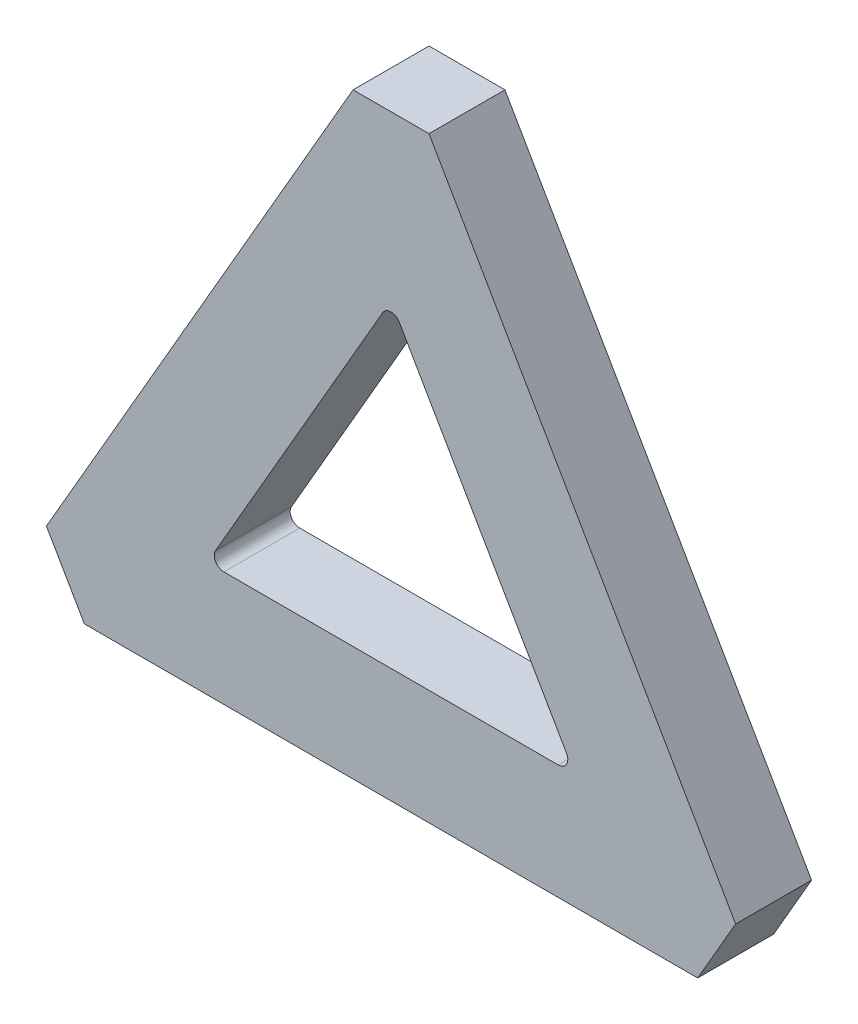
ISO-10303-21;
HEADER;
FILE_DESCRIPTION(('STEP AP214'),'2;1');
FILE_NAME('part.step','',(''),(''),'','','');
FILE_SCHEMA(('AUTOMOTIVE_DESIGN { 1 0 10303 214 1 1 1 1 }'));
ENDSEC;
DATA;
#1=APPLICATION_CONTEXT('core data for automotive mechanical design processes');
#2=APPLICATION_PROTOCOL_DEFINITION('international standard','automotive_design',2000,#1);
#3=PRODUCT_CONTEXT('',#1,'mechanical');
#4=PRODUCT('Part','Part','',(#3));
#5=PRODUCT_RELATED_PRODUCT_CATEGORY('part','',(#4));
#6=PRODUCT_DEFINITION_FORMATION('','',#4);
#7=PRODUCT_DEFINITION_CONTEXT('part definition',#1,'design');
#8=PRODUCT_DEFINITION('design','',#6,#7);
#9=PRODUCT_DEFINITION_SHAPE('','',#8);
#10=(LENGTH_UNIT() NAMED_UNIT(*) SI_UNIT(.MILLI.,.METRE.));
#11=(NAMED_UNIT(*) PLANE_ANGLE_UNIT() SI_UNIT($,.RADIAN.));
#12=(NAMED_UNIT(*) SI_UNIT($,.STERADIAN.) SOLID_ANGLE_UNIT());
#13=UNCERTAINTY_MEASURE_WITH_UNIT(LENGTH_MEASURE(1.E-05),#10,'distance_accuracy_value','');
#14=(GEOMETRIC_REPRESENTATION_CONTEXT(3) GLOBAL_UNCERTAINTY_ASSIGNED_CONTEXT((#13)) GLOBAL_UNIT_ASSIGNED_CONTEXT((#10,
#11,#12)) REPRESENTATION_CONTEXT('',''));
#15=CARTESIAN_POINT('',(0.,0.,0.));
#16=DIRECTION('',(0.,0.,1.));
#17=DIRECTION('',(1.,0.,0.));
#18=AXIS2_PLACEMENT_3D('',#15,#16,#17);
#19=CARTESIAN_POINT('',(0.,0.,1.984375));
#20=DIRECTION('',(0.,0.,-1.));
#21=DIRECTION('',(-1.,0.,0.));
#22=AXIS2_PLACEMENT_3D('',#19,#20,#21);
#23=PLANE('',#22);
#24=DIRECTION('',(-0.5,0.866025403784439,0.));
#25=VECTOR('',#24,1.);
#26=CARTESIAN_POINT('',(-10.,17.3205080756888,1.984375));
#27=LINE('',#26,#25);
#28=CARTESIAN_POINT('',(-0.992187500000001,1.71851916063475,1.984375));
#29=VERTEX_POINT('',#28);
#30=CARTESIAN_POINT('',(-9.0078125,15.601988915054,1.984375));
#31=VERTEX_POINT('',#30);
#32=EDGE_CURVE('E146',#29,#31,#27,.T.);
#33=ORIENTED_EDGE('',*,*,#32,.T.);
#34=DIRECTION('',(1.,0.,0.));
#35=VECTOR('',#34,1.);
#36=CARTESIAN_POINT('',(-10.9921875,15.601988915054,1.984375));
#37=LINE('',#36,#35);
#38=CARTESIAN_POINT('',(-10.9921875,15.601988915054,1.984375));
#39=VERTEX_POINT('',#38);
#40=EDGE_CURVE('E174',#31,#39,#37,.F.);
#41=ORIENTED_EDGE('',*,*,#40,.T.);
#42=DIRECTION('',(-0.5,-0.866025403784439,0.));
#43=VECTOR('',#42,1.);
#44=CARTESIAN_POINT('',(-20.,0.,1.984375));
#45=LINE('',#44,#43);
#46=CARTESIAN_POINT('',(-19.0078125,1.71851916063474,1.984375));
#47=VERTEX_POINT('',#46);
#48=EDGE_CURVE('E150',#39,#47,#45,.T.);
#49=ORIENTED_EDGE('',*,*,#48,.T.);
#50=DIRECTION('',(-0.500000000000001,0.866025403784438,0.));
#51=VECTOR('',#50,1.);
#52=CARTESIAN_POINT('',(-18.015625,0.,1.984375));
#53=LINE('',#52,#51);
#54=CARTESIAN_POINT('',(-18.015625,0.,1.984375));
#55=VERTEX_POINT('',#54);
#56=EDGE_CURVE('E157',#47,#55,#53,.F.);
#57=ORIENTED_EDGE('',*,*,#56,.T.);
#58=DIRECTION('',(1.,0.,0.));
#59=VECTOR('',#58,1.);
#60=CARTESIAN_POINT('',(0.,0.,1.984375));
#61=LINE('',#60,#59);
#62=CARTESIAN_POINT('',(-1.98437500000001,0.,1.984375));
#63=VERTEX_POINT('',#62);
#64=EDGE_CURVE('E140',#55,#63,#61,.T.);
#65=ORIENTED_EDGE('',*,*,#64,.T.);
#66=DIRECTION('',(-0.500000000000001,-0.866025403784438,0.));
#67=VECTOR('',#66,1.);
#68=CARTESIAN_POINT('',(-0.992187500000002,1.71851916063475,1.984375));
#69=LINE('',#68,#67);
#70=EDGE_CURVE('E165',#63,#29,#69,.F.);
#71=ORIENTED_EDGE('',*,*,#70,.T.);
#72=EDGE_LOOP('',(#33,#41,#49,#57,#65,#71));
#73=FACE_BOUND('',#72,.T.);
#74=DIRECTION('',(1.,0.,0.));
#75=VECTOR('',#74,1.);
#76=CARTESIAN_POINT('',(-5.19615242270663,3.,1.984375));
#77=LINE('',#76,#75);
#78=CARTESIAN_POINT('',(-14.3708348754012,3.,1.984375));
#79=VERTEX_POINT('',#78);
#80=CARTESIAN_POINT('',(-5.62916512459885,3.,1.984375));
#81=VERTEX_POINT('',#80);
#82=EDGE_CURVE('E205',#79,#81,#77,.T.);
#83=ORIENTED_EDGE('',*,*,#82,.F.);
#84=CARTESIAN_POINT('',(-14.3708348754012,3.25,1.984375));
#85=DIRECTION('',(0.,0.,-1.));
#86=DIRECTION('',(-1.,0.,0.));
#87=AXIS2_PLACEMENT_3D('',#84,#85,#86);
#88=CIRCLE('',#87,0.25);
#89=CARTESIAN_POINT('',(-14.5873412263473,3.375,1.984375));
#90=VERTEX_POINT('',#89);
#91=EDGE_CURVE('E46',#79,#90,#88,.T.);
#92=ORIENTED_EDGE('',*,*,#91,.T.);
#93=DIRECTION('',(-0.5,-0.866025403784439,0.));
#94=VECTOR('',#93,1.);
#95=CARTESIAN_POINT('',(-14.8038475772934,3.,1.984375));
#96=LINE('',#95,#94);
#97=CARTESIAN_POINT('',(-10.2165063509461,10.9455080756888,1.984375));
#98=VERTEX_POINT('',#97);
#99=EDGE_CURVE('E212',#98,#90,#96,.T.);
#100=ORIENTED_EDGE('',*,*,#99,.F.);
#101=CARTESIAN_POINT('',(-10.,10.8205080756888,1.984375));
#102=DIRECTION('',(0.,0.,-1.));
#103=DIRECTION('',(-1.,0.,0.));
#104=AXIS2_PLACEMENT_3D('',#101,#102,#103);
#105=CIRCLE('',#104,0.25);
#106=CARTESIAN_POINT('',(-9.7834936490539,10.9455080756888,1.984375));
#107=VERTEX_POINT('',#106);
#108=EDGE_CURVE('E11',#98,#107,#105,.T.);
#109=ORIENTED_EDGE('',*,*,#108,.T.);
#110=DIRECTION('',(-0.5,0.866025403784439,0.));
#111=VECTOR('',#110,1.);
#112=CARTESIAN_POINT('',(-10.,11.3205080756888,1.984375));
#113=LINE('',#112,#111);
#114=CARTESIAN_POINT('',(-5.41265877365274,3.375,1.984375));
#115=VERTEX_POINT('',#114);
#116=EDGE_CURVE('E210',#115,#107,#113,.T.);
#117=ORIENTED_EDGE('',*,*,#116,.F.);
#118=CARTESIAN_POINT('',(-5.62916512459885,3.25,1.984375));
#119=DIRECTION('',(0.,0.,-1.));
#120=DIRECTION('',(-1.,0.,0.));
#121=AXIS2_PLACEMENT_3D('',#118,#119,#120);
#122=CIRCLE('',#121,0.25);
#123=EDGE_CURVE('E192',#115,#81,#122,.T.);
#124=ORIENTED_EDGE('',*,*,#123,.T.);
#125=EDGE_LOOP('',(#83,#92,#100,#109,#117,#124));
#126=FACE_BOUND('',#125,.T.);
#127=ADVANCED_FACE('F31',(#73,#126),#23,.F.);
#128=CARTESIAN_POINT('',(0.,0.,0.));
#129=DIRECTION('',(0.,0.,-1.));
#130=DIRECTION('',(-1.,0.,0.));
#131=AXIS2_PLACEMENT_3D('',#128,#129,#130);
#132=PLANE('',#131);
#133=DIRECTION('',(-0.5,-0.866025403784439,0.));
#134=VECTOR('',#133,1.);
#135=CARTESIAN_POINT('',(-20.,0.,0.));
#136=LINE('',#135,#134);
#137=CARTESIAN_POINT('',(-10.9921875,15.601988915054,0.));
#138=VERTEX_POINT('',#137);
#139=CARTESIAN_POINT('',(-19.0078125,1.71851916063474,0.));
#140=VERTEX_POINT('',#139);
#141=EDGE_CURVE('E147',#138,#140,#136,.T.);
#142=ORIENTED_EDGE('',*,*,#141,.F.);
#143=DIRECTION('',(-1.,0.,0.));
#144=VECTOR('',#143,1.);
#145=CARTESIAN_POINT('',(0.,15.601988915054,0.));
#146=LINE('',#145,#144);
#147=CARTESIAN_POINT('',(-9.0078125,15.601988915054,0.));
#148=VERTEX_POINT('',#147);
#149=EDGE_CURVE('E170',#138,#148,#146,.F.);
#150=ORIENTED_EDGE('',*,*,#149,.T.);
#151=DIRECTION('',(-0.5,0.866025403784439,0.));
#152=VECTOR('',#151,1.);
#153=CARTESIAN_POINT('',(-10.,17.3205080756888,0.));
#154=LINE('',#153,#152);
#155=CARTESIAN_POINT('',(-0.992187500000002,1.71851916063475,0.));
#156=VERTEX_POINT('',#155);
#157=EDGE_CURVE('E152',#156,#148,#154,.T.);
#158=ORIENTED_EDGE('',*,*,#157,.F.);
#159=DIRECTION('',(0.500000000000001,0.866025403784438,0.));
#160=VECTOR('',#159,1.);
#161=CARTESIAN_POINT('',(-1.48828125,0.859259580317375,0.));
#162=LINE('',#161,#160);
#163=CARTESIAN_POINT('',(-1.98437500000001,0.,0.));
#164=VERTEX_POINT('',#163);
#165=EDGE_CURVE('E145',#156,#164,#162,.F.);
#166=ORIENTED_EDGE('',*,*,#165,.T.);
#167=DIRECTION('',(1.,0.,0.));
#168=VECTOR('',#167,1.);
#169=CARTESIAN_POINT('',(0.,0.,0.));
#170=LINE('',#169,#168);
#171=CARTESIAN_POINT('',(-18.015625,0.,0.));
#172=VERTEX_POINT('',#171);
#173=EDGE_CURVE('E137',#172,#164,#170,.T.);
#174=ORIENTED_EDGE('',*,*,#173,.F.);
#175=DIRECTION('',(0.500000000000001,-0.866025403784438,0.));
#176=VECTOR('',#175,1.);
#177=CARTESIAN_POINT('',(-13.51171875,-7.80099445752703,0.));
#178=LINE('',#177,#176);
#179=EDGE_CURVE('E122',#172,#140,#178,.F.);
#180=ORIENTED_EDGE('',*,*,#179,.T.);
#181=EDGE_LOOP('',(#142,#150,#158,#166,#174,#180));
#182=FACE_BOUND('',#181,.T.);
#183=DIRECTION('',(-0.5,0.866025403784439,0.));
#184=VECTOR('',#183,1.);
#185=CARTESIAN_POINT('',(-10.,11.3205080756888,0.));
#186=LINE('',#185,#184);
#187=CARTESIAN_POINT('',(-5.41265877365274,3.375,0.));
#188=VERTEX_POINT('',#187);
#189=CARTESIAN_POINT('',(-9.7834936490539,10.9455080756888,0.));
#190=VERTEX_POINT('',#189);
#191=EDGE_CURVE('E200',#188,#190,#186,.T.);
#192=ORIENTED_EDGE('',*,*,#191,.T.);
#193=CARTESIAN_POINT('',(-10.,10.8205080756888,0.));
#194=DIRECTION('',(0.,0.,-1.));
#195=DIRECTION('',(-1.,0.,0.));
#196=AXIS2_PLACEMENT_3D('',#193,#194,#195);
#197=CIRCLE('',#196,0.25);
#198=CARTESIAN_POINT('',(-10.2165063509461,10.9455080756888,0.));
#199=VERTEX_POINT('',#198);
#200=EDGE_CURVE('E39',#190,#199,#197,.F.);
#201=ORIENTED_EDGE('',*,*,#200,.T.);
#202=DIRECTION('',(-0.5,-0.866025403784439,0.));
#203=VECTOR('',#202,1.);
#204=CARTESIAN_POINT('',(-14.8038475772934,3.,0.));
#205=LINE('',#204,#203);
#206=CARTESIAN_POINT('',(-14.5873412263473,3.375,0.));
#207=VERTEX_POINT('',#206);
#208=EDGE_CURVE('E198',#199,#207,#205,.T.);
#209=ORIENTED_EDGE('',*,*,#208,.T.);
#210=CARTESIAN_POINT('',(-14.3708348754012,3.25,0.));
#211=DIRECTION('',(0.,0.,-1.));
#212=DIRECTION('',(-1.,0.,0.));
#213=AXIS2_PLACEMENT_3D('',#210,#211,#212);
#214=CIRCLE('',#213,0.25);
#215=CARTESIAN_POINT('',(-14.3708348754012,3.,0.));
#216=VERTEX_POINT('',#215);
#217=EDGE_CURVE('E194',#207,#216,#214,.F.);
#218=ORIENTED_EDGE('',*,*,#217,.T.);
#219=DIRECTION('',(1.,0.,0.));
#220=VECTOR('',#219,1.);
#221=CARTESIAN_POINT('',(-5.19615242270663,3.,0.));
#222=LINE('',#221,#220);
#223=CARTESIAN_POINT('',(-5.62916512459885,3.,0.));
#224=VERTEX_POINT('',#223);
#225=EDGE_CURVE('E221',#216,#224,#222,.T.);
#226=ORIENTED_EDGE('',*,*,#225,.T.);
#227=CARTESIAN_POINT('',(-5.62916512459885,3.25,0.));
#228=DIRECTION('',(0.,0.,-1.));
#229=DIRECTION('',(-1.,0.,0.));
#230=AXIS2_PLACEMENT_3D('',#227,#228,#229);
#231=CIRCLE('',#230,0.25);
#232=EDGE_CURVE('E190',#224,#188,#231,.F.);
#233=ORIENTED_EDGE('',*,*,#232,.T.);
#234=EDGE_LOOP('',(#192,#201,#209,#218,#226,#233));
#235=FACE_BOUND('',#234,.T.);
#236=ADVANCED_FACE('F142',(#182,#235),#132,.T.);
#237=CARTESIAN_POINT('',(-10.,17.3205080756888,1.984375));
#238=DIRECTION('',(-0.866025403784439,-0.5,0.));
#239=DIRECTION('',(0.5,-0.866025403784439,0.));
#240=AXIS2_PLACEMENT_3D('',#237,#238,#239);
#241=PLANE('',#240);
#242=ORIENTED_EDGE('',*,*,#157,.T.);
#243=DIRECTION('',(0.,0.,1.));
#244=VECTOR('',#243,1.);
#245=CARTESIAN_POINT('',(-9.0078125,15.601988915054,1.984375));
#246=LINE('',#245,#244);
#247=EDGE_CURVE('E172',#148,#31,#246,.T.);
#248=ORIENTED_EDGE('',*,*,#247,.T.);
#249=ORIENTED_EDGE('',*,*,#32,.F.);
#250=DIRECTION('',(0.,0.,-1.));
#251=VECTOR('',#250,1.);
#252=CARTESIAN_POINT('',(-0.992187500000002,1.71851916063475,1.984375));
#253=LINE('',#252,#251);
#254=EDGE_CURVE('E159',#29,#156,#253,.T.);
#255=ORIENTED_EDGE('',*,*,#254,.T.);
#256=EDGE_LOOP('',(#242,#248,#249,#255));
#257=FACE_BOUND('',#256,.T.);
#258=ADVANCED_FACE('F229',(#257),#241,.F.);
#259=CARTESIAN_POINT('',(-20.,0.,1.984375));
#260=DIRECTION('',(0.866025403784439,-0.5,0.));
#261=DIRECTION('',(0.5,0.866025403784439,0.));
#262=AXIS2_PLACEMENT_3D('',#259,#260,#261);
#263=PLANE('',#262);
#264=ORIENTED_EDGE('',*,*,#48,.F.);
#265=DIRECTION('',(0.,0.,-1.));
#266=VECTOR('',#265,1.);
#267=CARTESIAN_POINT('',(-10.9921875,15.601988915054,1.984375));
#268=LINE('',#267,#266);
#269=EDGE_CURVE('E167',#39,#138,#268,.T.);
#270=ORIENTED_EDGE('',*,*,#269,.T.);
#271=ORIENTED_EDGE('',*,*,#141,.T.);
#272=DIRECTION('',(0.,0.,1.));
#273=VECTOR('',#272,1.);
#274=CARTESIAN_POINT('',(-19.0078125,1.71851916063474,1.984375));
#275=LINE('',#274,#273);
#276=EDGE_CURVE('E128',#140,#47,#275,.T.);
#277=ORIENTED_EDGE('',*,*,#276,.T.);
#278=EDGE_LOOP('',(#264,#270,#271,#277));
#279=FACE_BOUND('',#278,.T.);
#280=ADVANCED_FACE('F239',(#279),#263,.F.);
#281=CARTESIAN_POINT('',(0.,0.,1.984375));
#282=DIRECTION('',(0.,1.,0.));
#283=DIRECTION('',(-1.,0.,0.));
#284=AXIS2_PLACEMENT_3D('',#281,#282,#283);
#285=PLANE('',#284);
#286=ORIENTED_EDGE('',*,*,#173,.T.);
#287=DIRECTION('',(0.,0.,1.));
#288=VECTOR('',#287,1.);
#289=CARTESIAN_POINT('',(-1.98437500000001,0.,1.984375));
#290=LINE('',#289,#288);
#291=EDGE_CURVE('E163',#164,#63,#290,.T.);
#292=ORIENTED_EDGE('',*,*,#291,.T.);
#293=ORIENTED_EDGE('',*,*,#64,.F.);
#294=DIRECTION('',(0.,0.,-1.));
#295=VECTOR('',#294,1.);
#296=CARTESIAN_POINT('',(-18.015625,0.,1.984375));
#297=LINE('',#296,#295);
#298=EDGE_CURVE('E126',#55,#172,#297,.T.);
#299=ORIENTED_EDGE('',*,*,#298,.T.);
#300=EDGE_LOOP('',(#286,#292,#293,#299));
#301=FACE_BOUND('',#300,.T.);
#302=ADVANCED_FACE('F136',(#301),#285,.F.);
#303=CARTESIAN_POINT('',(-5.19615242270663,3.,1.984375));
#304=DIRECTION('',(0.,1.,0.));
#305=DIRECTION('',(0.,0.,1.));
#306=AXIS2_PLACEMENT_3D('',#303,#304,#305);
#307=PLANE('',#306);
#308=ORIENTED_EDGE('',*,*,#82,.T.);
#309=DIRECTION('',(0.,0.,-1.));
#310=VECTOR('',#309,1.);
#311=CARTESIAN_POINT('',(-5.62916512459885,3.,0.));
#312=LINE('',#311,#310);
#313=EDGE_CURVE('E178',#81,#224,#312,.T.);
#314=ORIENTED_EDGE('',*,*,#313,.T.);
#315=ORIENTED_EDGE('',*,*,#225,.F.);
#316=DIRECTION('',(0.,0.,-1.));
#317=VECTOR('',#316,1.);
#318=CARTESIAN_POINT('',(-14.3708348754012,3.,1.984375));
#319=LINE('',#318,#317);
#320=EDGE_CURVE('E176',#216,#79,#319,.F.);
#321=ORIENTED_EDGE('',*,*,#320,.T.);
#322=EDGE_LOOP('',(#308,#314,#315,#321));
#323=FACE_BOUND('',#322,.T.);
#324=ADVANCED_FACE('F260',(#323),#307,.T.);
#325=CARTESIAN_POINT('',(-10.,11.3205080756888,1.984375));
#326=DIRECTION('',(-0.866025403784438,-0.5,0.));
#327=DIRECTION('',(0.5,-0.866025403784439,0.));
#328=AXIS2_PLACEMENT_3D('',#325,#326,#327);
#329=PLANE('',#328);
#330=ORIENTED_EDGE('',*,*,#191,.F.);
#331=DIRECTION('',(0.,0.,-1.));
#332=VECTOR('',#331,1.);
#333=CARTESIAN_POINT('',(-5.41265877365274,3.375,1.984375));
#334=LINE('',#333,#332);
#335=EDGE_CURVE('E184',#188,#115,#334,.F.);
#336=ORIENTED_EDGE('',*,*,#335,.T.);
#337=ORIENTED_EDGE('',*,*,#116,.T.);
#338=DIRECTION('',(0.,0.,-1.));
#339=VECTOR('',#338,1.);
#340=CARTESIAN_POINT('',(-9.7834936490539,10.9455080756888,0.));
#341=LINE('',#340,#339);
#342=EDGE_CURVE('E181',#107,#190,#341,.T.);
#343=ORIENTED_EDGE('',*,*,#342,.T.);
#344=EDGE_LOOP('',(#330,#336,#337,#343));
#345=FACE_BOUND('',#344,.T.);
#346=ADVANCED_FACE('F214',(#345),#329,.T.);
#347=CARTESIAN_POINT('',(-14.8038475772934,3.,1.984375));
#348=DIRECTION('',(0.866025403784439,-0.5,0.));
#349=DIRECTION('',(0.5,0.866025403784439,0.));
#350=AXIS2_PLACEMENT_3D('',#347,#348,#349);
#351=PLANE('',#350);
#352=ORIENTED_EDGE('',*,*,#99,.T.);
#353=DIRECTION('',(0.,0.,-1.));
#354=VECTOR('',#353,1.);
#355=CARTESIAN_POINT('',(-14.5873412263473,3.375,0.));
#356=LINE('',#355,#354);
#357=EDGE_CURVE('E187',#90,#207,#356,.T.);
#358=ORIENTED_EDGE('',*,*,#357,.T.);
#359=ORIENTED_EDGE('',*,*,#208,.F.);
#360=DIRECTION('',(0.,0.,-1.));
#361=VECTOR('',#360,1.);
#362=CARTESIAN_POINT('',(-10.2165063509461,10.9455080756888,1.984375));
#363=LINE('',#362,#361);
#364=EDGE_CURVE('E53',#199,#98,#363,.F.);
#365=ORIENTED_EDGE('',*,*,#364,.T.);
#366=EDGE_LOOP('',(#352,#358,#359,#365));
#367=FACE_BOUND('',#366,.T.);
#368=ADVANCED_FACE('F203',(#367),#351,.T.);
#369=CARTESIAN_POINT('',(-18.015625,0.,1.984375));
#370=DIRECTION('',(0.866025403784438,0.500000000000001,0.));
#371=DIRECTION('',(-0.500000000000001,0.866025403784438,0.));
#372=AXIS2_PLACEMENT_3D('',#369,#370,#371);
#373=PLANE('',#372);
#374=ORIENTED_EDGE('',*,*,#56,.F.);
#375=ORIENTED_EDGE('',*,*,#276,.F.);
#376=ORIENTED_EDGE('',*,*,#179,.F.);
#377=ORIENTED_EDGE('',*,*,#298,.F.);
#378=EDGE_LOOP('',(#374,#375,#376,#377));
#379=FACE_BOUND('',#378,.T.);
#380=ADVANCED_FACE('F125',(#379),#373,.F.);
#381=CARTESIAN_POINT('',(-0.992187500000002,1.71851916063475,1.984375));
#382=DIRECTION('',(-0.866025403784438,0.500000000000001,0.));
#383=DIRECTION('',(-0.500000000000001,-0.866025403784438,0.));
#384=AXIS2_PLACEMENT_3D('',#381,#382,#383);
#385=PLANE('',#384);
#386=ORIENTED_EDGE('',*,*,#70,.F.);
#387=ORIENTED_EDGE('',*,*,#291,.F.);
#388=ORIENTED_EDGE('',*,*,#165,.F.);
#389=ORIENTED_EDGE('',*,*,#254,.F.);
#390=EDGE_LOOP('',(#386,#387,#388,#389));
#391=FACE_BOUND('',#390,.T.);
#392=ADVANCED_FACE('F242',(#391),#385,.F.);
#393=CARTESIAN_POINT('',(-10.9921875,15.601988915054,1.984375));
#394=DIRECTION('',(0.,-1.,0.));
#395=DIRECTION('',(1.,0.,0.));
#396=AXIS2_PLACEMENT_3D('',#393,#394,#395);
#397=PLANE('',#396);
#398=ORIENTED_EDGE('',*,*,#40,.F.);
#399=ORIENTED_EDGE('',*,*,#247,.F.);
#400=ORIENTED_EDGE('',*,*,#149,.F.);
#401=ORIENTED_EDGE('',*,*,#269,.F.);
#402=EDGE_LOOP('',(#398,#399,#400,#401));
#403=FACE_BOUND('',#402,.T.);
#404=ADVANCED_FACE('F234',(#403),#397,.F.);
#405=CARTESIAN_POINT('',(-5.62916512459885,3.25,1.984375));
#406=DIRECTION('',(0.,0.,1.));
#407=DIRECTION('',(1.,0.,0.));
#408=AXIS2_PLACEMENT_3D('',#405,#406,#407);
#409=CYLINDRICAL_SURFACE('',#408,0.25);
#410=ORIENTED_EDGE('',*,*,#123,.F.);
#411=ORIENTED_EDGE('',*,*,#335,.F.);
#412=ORIENTED_EDGE('',*,*,#232,.F.);
#413=ORIENTED_EDGE('',*,*,#313,.F.);
#414=EDGE_LOOP('',(#410,#411,#412,#413));
#415=FACE_BOUND('',#414,.T.);
#416=ADVANCED_FACE('F249',(#415),#409,.F.);
#417=CARTESIAN_POINT('',(-14.3708348754012,3.25,1.984375));
#418=DIRECTION('',(0.,0.,1.));
#419=DIRECTION('',(1.,0.,0.));
#420=AXIS2_PLACEMENT_3D('',#417,#418,#419);
#421=CYLINDRICAL_SURFACE('',#420,0.25);
#422=ORIENTED_EDGE('',*,*,#91,.F.);
#423=ORIENTED_EDGE('',*,*,#320,.F.);
#424=ORIENTED_EDGE('',*,*,#217,.F.);
#425=ORIENTED_EDGE('',*,*,#357,.F.);
#426=EDGE_LOOP('',(#422,#423,#424,#425));
#427=FACE_BOUND('',#426,.T.);
#428=ADVANCED_FACE('F326',(#427),#421,.F.);
#429=CARTESIAN_POINT('',(-10.,10.8205080756888,1.984375));
#430=DIRECTION('',(0.,0.,1.));
#431=DIRECTION('',(1.,0.,0.));
#432=AXIS2_PLACEMENT_3D('',#429,#430,#431);
#433=CYLINDRICAL_SURFACE('',#432,0.25);
#434=ORIENTED_EDGE('',*,*,#108,.F.);
#435=ORIENTED_EDGE('',*,*,#364,.F.);
#436=ORIENTED_EDGE('',*,*,#200,.F.);
#437=ORIENTED_EDGE('',*,*,#342,.F.);
#438=EDGE_LOOP('',(#434,#435,#436,#437));
#439=FACE_BOUND('',#438,.T.);
#440=ADVANCED_FACE('F33',(#439),#433,.F.);
#441=CLOSED_SHELL('',(#127,#236,#258,#280,#302,#324,#346,#368,#380,#392,#404,#416,#428,#440));
#442=MANIFOLD_SOLID_BREP('B2',#441);
#443=ADVANCED_BREP_SHAPE_REPRESENTATION('',(#18,#442),#14);
#444=SHAPE_DEFINITION_REPRESENTATION(#9,#443);
ENDSEC;
END-ISO-10303-21;
